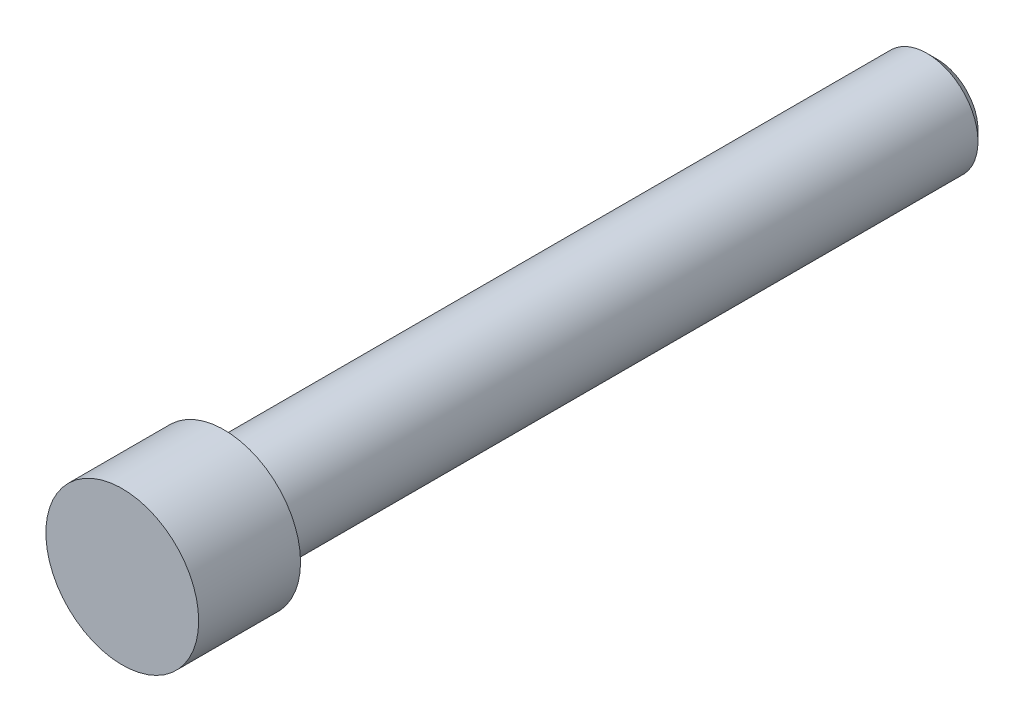
ISO-10303-21;
HEADER;
FILE_DESCRIPTION(('STEP AP214'),'2;1');
FILE_NAME('part.step','',(''),(''),'','','');
FILE_SCHEMA(('AUTOMOTIVE_DESIGN { 1 0 10303 214 1 1 1 1 }'));
ENDSEC;
DATA;
#1=APPLICATION_CONTEXT('core data for automotive mechanical design processes');
#2=APPLICATION_PROTOCOL_DEFINITION('international standard','automotive_design',2000,#1);
#3=PRODUCT_CONTEXT('',#1,'mechanical');
#4=PRODUCT('Part','Part','',(#3));
#5=PRODUCT_RELATED_PRODUCT_CATEGORY('part','',(#4));
#6=PRODUCT_DEFINITION_FORMATION('','',#4);
#7=PRODUCT_DEFINITION_CONTEXT('part definition',#1,'design');
#8=PRODUCT_DEFINITION('design','',#6,#7);
#9=PRODUCT_DEFINITION_SHAPE('','',#8);
#10=(LENGTH_UNIT() NAMED_UNIT(*) SI_UNIT(.MILLI.,.METRE.));
#11=(NAMED_UNIT(*) PLANE_ANGLE_UNIT() SI_UNIT($,.RADIAN.));
#12=(NAMED_UNIT(*) SI_UNIT($,.STERADIAN.) SOLID_ANGLE_UNIT());
#13=UNCERTAINTY_MEASURE_WITH_UNIT(LENGTH_MEASURE(1.E-05),#10,'distance_accuracy_value','');
#14=(GEOMETRIC_REPRESENTATION_CONTEXT(3) GLOBAL_UNCERTAINTY_ASSIGNED_CONTEXT((#13)) GLOBAL_UNIT_ASSIGNED_CONTEXT((#10,
#11,#12)) REPRESENTATION_CONTEXT('',''));
#15=CARTESIAN_POINT('',(0.,0.,0.));
#16=DIRECTION('',(0.,0.,1.));
#17=DIRECTION('',(1.,0.,0.));
#18=AXIS2_PLACEMENT_3D('',#15,#16,#17);
#19=CARTESIAN_POINT('',(0.,0.,14.));
#20=DIRECTION('',(0.,0.,-1.));
#21=DIRECTION('',(-1.,0.,0.));
#22=AXIS2_PLACEMENT_3D('',#19,#20,#21);
#23=CYLINDRICAL_SURFACE('',#22,1.);
#24=CARTESIAN_POINT('',(0.,0.,0.199999999999995));
#25=DIRECTION('',(0.,0.,1.));
#26=DIRECTION('',(1.,0.,0.));
#27=AXIS2_PLACEMENT_3D('',#24,#25,#26);
#28=CIRCLE('',#27,1.);
#29=CARTESIAN_POINT('',(1.,0.,0.199999999999995));
#30=VERTEX_POINT('',#29);
#31=EDGE_CURVE('E54',#30,#30,#28,.T.);
#32=ORIENTED_EDGE('',*,*,#31,.T.);
#33=EDGE_LOOP('',(#32));
#34=FACE_BOUND('',#33,.T.);
#35=CARTESIAN_POINT('',(0.,0.,14.));
#36=DIRECTION('',(0.,0.,1.));
#37=DIRECTION('',(1.,0.,0.));
#38=AXIS2_PLACEMENT_3D('',#35,#36,#37);
#39=CIRCLE('',#38,1.);
#40=CARTESIAN_POINT('',(1.,0.,14.));
#41=VERTEX_POINT('',#40);
#42=EDGE_CURVE('E59',#41,#41,#39,.T.);
#43=ORIENTED_EDGE('',*,*,#42,.F.);
#44=EDGE_LOOP('',(#43));
#45=FACE_BOUND('',#44,.T.);
#46=ADVANCED_FACE('F45',(#34,#45),#23,.T.);
#47=CARTESIAN_POINT('',(0.,0.,0.));
#48=DIRECTION('',(0.,0.,1.));
#49=DIRECTION('',(1.,0.,0.));
#50=AXIS2_PLACEMENT_3D('',#47,#48,#49);
#51=PLANE('',#50);
#52=CARTESIAN_POINT('',(0.,0.,0.));
#53=DIRECTION('',(0.,0.,1.));
#54=DIRECTION('',(1.,0.,0.));
#55=AXIS2_PLACEMENT_3D('',#52,#53,#54);
#56=CIRCLE('',#55,0.800000000000002);
#57=CARTESIAN_POINT('',(0.800000000000002,0.,0.));
#58=VERTEX_POINT('',#57);
#59=EDGE_CURVE('E10',#58,#58,#56,.F.);
#60=ORIENTED_EDGE('',*,*,#59,.T.);
#61=EDGE_LOOP('',(#60));
#62=FACE_BOUND('',#61,.T.);
#63=ADVANCED_FACE('F80',(#62),#51,.F.);
#64=CARTESIAN_POINT('',(0.,0.,16.));
#65=DIRECTION('',(0.,0.,-1.));
#66=DIRECTION('',(-1.,0.,0.));
#67=AXIS2_PLACEMENT_3D('',#64,#65,#66);
#68=CYLINDRICAL_SURFACE('',#67,1.5);
#69=CARTESIAN_POINT('',(0.,0.,16.));
#70=DIRECTION('',(0.,0.,1.));
#71=DIRECTION('',(1.,0.,0.));
#72=AXIS2_PLACEMENT_3D('',#69,#70,#71);
#73=CIRCLE('',#72,1.5);
#74=CARTESIAN_POINT('',(1.5,0.,16.));
#75=VERTEX_POINT('',#74);
#76=EDGE_CURVE('E64',#75,#75,#73,.T.);
#77=ORIENTED_EDGE('',*,*,#76,.F.);
#78=EDGE_LOOP('',(#77));
#79=FACE_BOUND('',#78,.T.);
#80=CARTESIAN_POINT('',(0.,0.,14.));
#81=DIRECTION('',(0.,0.,1.));
#82=DIRECTION('',(1.,0.,0.));
#83=AXIS2_PLACEMENT_3D('',#80,#81,#82);
#84=CIRCLE('',#83,1.5);
#85=CARTESIAN_POINT('',(1.5,0.,14.));
#86=VERTEX_POINT('',#85);
#87=EDGE_CURVE('E67',#86,#86,#84,.T.);
#88=ORIENTED_EDGE('',*,*,#87,.T.);
#89=EDGE_LOOP('',(#88));
#90=FACE_BOUND('',#89,.T.);
#91=ADVANCED_FACE('F77',(#79,#90),#68,.T.);
#92=CARTESIAN_POINT('',(0.,0.,16.));
#93=DIRECTION('',(0.,0.,1.));
#94=DIRECTION('',(1.,0.,0.));
#95=AXIS2_PLACEMENT_3D('',#92,#93,#94);
#96=PLANE('',#95);
#97=ORIENTED_EDGE('',*,*,#76,.T.);
#98=EDGE_LOOP('',(#97));
#99=FACE_BOUND('',#98,.T.);
#100=ADVANCED_FACE('F75',(#99),#96,.T.);
#101=CARTESIAN_POINT('',(0.,0.,14.));
#102=DIRECTION('',(0.,0.,1.));
#103=DIRECTION('',(1.,0.,0.));
#104=AXIS2_PLACEMENT_3D('',#101,#102,#103);
#105=PLANE('',#104);
#106=ORIENTED_EDGE('',*,*,#42,.T.);
#107=EDGE_LOOP('',(#106));
#108=FACE_BOUND('',#107,.T.);
#109=ORIENTED_EDGE('',*,*,#87,.F.);
#110=EDGE_LOOP('',(#109));
#111=FACE_BOUND('',#110,.T.);
#112=ADVANCED_FACE('F84',(#108,#111),#105,.F.);
#113=CARTESIAN_POINT('',(0.,0.,0.199999999999995));
#114=DIRECTION('',(0.,0.,1.));
#115=DIRECTION('',(1.,0.,0.));
#116=AXIS2_PLACEMENT_3D('',#113,#114,#115);
#117=CONICAL_SURFACE('',#116,1.,0.785398163397454);
#118=ORIENTED_EDGE('',*,*,#59,.F.);
#119=EDGE_LOOP('',(#118));
#120=FACE_BOUND('',#119,.T.);
#121=ORIENTED_EDGE('',*,*,#31,.F.);
#122=EDGE_LOOP('',(#121));
#123=FACE_BOUND('',#122,.T.);
#124=ADVANCED_FACE('F48',(#120,#123),#117,.T.);
#125=CLOSED_SHELL('',(#46,#63,#91,#100,#112,#124));
#126=MANIFOLD_SOLID_BREP('B2',#125);
#127=ADVANCED_BREP_SHAPE_REPRESENTATION('',(#18,#126),#14);
#128=SHAPE_DEFINITION_REPRESENTATION(#9,#127);
ENDSEC;
END-ISO-10303-21;
